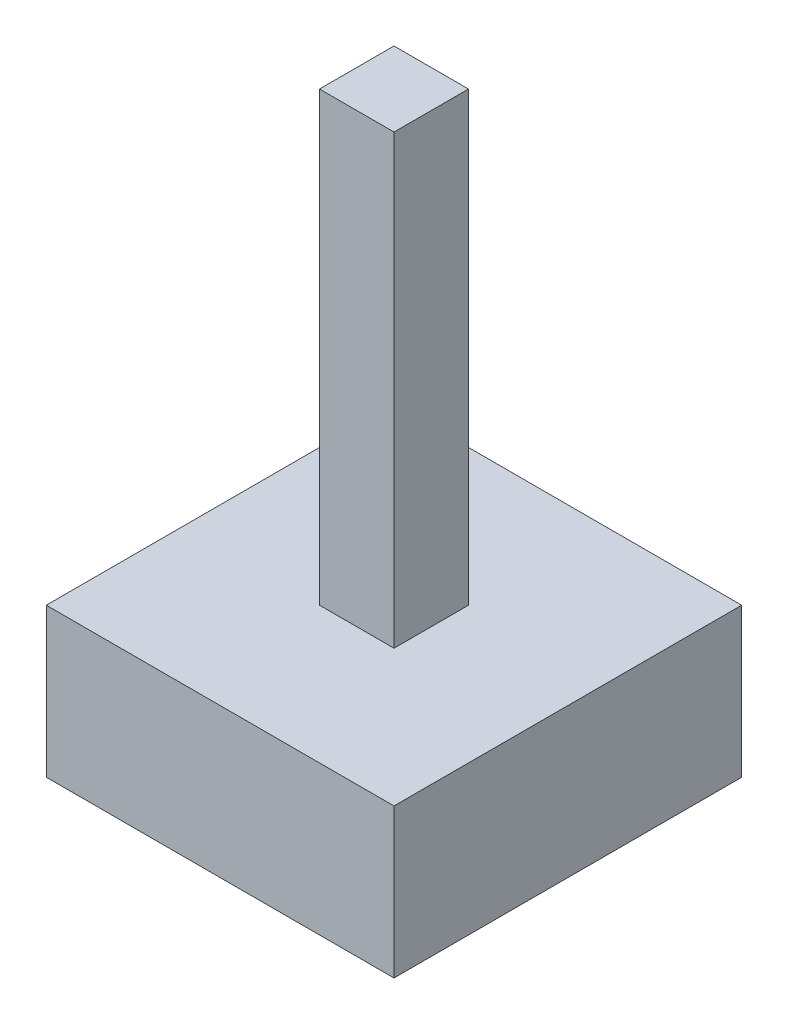
ISO-10303-21;
HEADER;
FILE_DESCRIPTION(('STEP AP214'),'2;1');
FILE_NAME('part.step','',(''),(''),'','','');
FILE_SCHEMA(('AUTOMOTIVE_DESIGN { 1 0 10303 214 1 1 1 1 }'));
ENDSEC;
DATA;
#1=APPLICATION_CONTEXT('core data for automotive mechanical design processes');
#2=APPLICATION_PROTOCOL_DEFINITION('international standard','automotive_design',2000,#1);
#3=PRODUCT_CONTEXT('',#1,'mechanical');
#4=PRODUCT('Part','Part','',(#3));
#5=PRODUCT_RELATED_PRODUCT_CATEGORY('part','',(#4));
#6=PRODUCT_DEFINITION_FORMATION('','',#4);
#7=PRODUCT_DEFINITION_CONTEXT('part definition',#1,'design');
#8=PRODUCT_DEFINITION('design','',#6,#7);
#9=PRODUCT_DEFINITION_SHAPE('','',#8);
#10=(LENGTH_UNIT() NAMED_UNIT(*) SI_UNIT(.MILLI.,.METRE.));
#11=(NAMED_UNIT(*) PLANE_ANGLE_UNIT() SI_UNIT($,.RADIAN.));
#12=(NAMED_UNIT(*) SI_UNIT($,.STERADIAN.) SOLID_ANGLE_UNIT());
#13=UNCERTAINTY_MEASURE_WITH_UNIT(LENGTH_MEASURE(1.E-05),#10,'distance_accuracy_value','');
#14=(GEOMETRIC_REPRESENTATION_CONTEXT(3) GLOBAL_UNCERTAINTY_ASSIGNED_CONTEXT((#13)) GLOBAL_UNIT_ASSIGNED_CONTEXT((#10,
#11,#12)) REPRESENTATION_CONTEXT('',''));
#15=CARTESIAN_POINT('',(0.,0.,0.));
#16=DIRECTION('',(0.,0.,1.));
#17=DIRECTION('',(1.,0.,0.));
#18=AXIS2_PLACEMENT_3D('',#15,#16,#17);
#19=CARTESIAN_POINT('',(0.,3.81,0.));
#20=DIRECTION('',(0.,-1.,0.));
#21=DIRECTION('',(0.,0.,-1.));
#22=AXIS2_PLACEMENT_3D('',#19,#20,#21);
#23=PLANE('',#22);
#24=DIRECTION('',(0.,0.,1.));
#25=VECTOR('',#24,1.);
#26=CARTESIAN_POINT('',(0.,3.81,0.));
#27=LINE('',#26,#25);
#28=CARTESIAN_POINT('',(0.,3.81,-8.89));
#29=VERTEX_POINT('',#28);
#30=CARTESIAN_POINT('',(0.,3.81,0.));
#31=VERTEX_POINT('',#30);
#32=EDGE_CURVE('E132',#29,#31,#27,.T.);
#33=ORIENTED_EDGE('',*,*,#32,.T.);
#34=DIRECTION('',(1.,0.,0.));
#35=VECTOR('',#34,1.);
#36=CARTESIAN_POINT('',(0.,3.81,0.));
#37=LINE('',#36,#35);
#38=CARTESIAN_POINT('',(8.89,3.81,0.));
#39=VERTEX_POINT('',#38);
#40=EDGE_CURVE('E139',#31,#39,#37,.T.);
#41=ORIENTED_EDGE('',*,*,#40,.T.);
#42=DIRECTION('',(0.,0.,-1.));
#43=VECTOR('',#42,1.);
#44=CARTESIAN_POINT('',(8.89,3.81,0.));
#45=LINE('',#44,#43);
#46=CARTESIAN_POINT('',(8.89,3.81,-8.89));
#47=VERTEX_POINT('',#46);
#48=EDGE_CURVE('E143',#39,#47,#45,.T.);
#49=ORIENTED_EDGE('',*,*,#48,.T.);
#50=DIRECTION('',(-1.,0.,0.));
#51=VECTOR('',#50,1.);
#52=CARTESIAN_POINT('',(0.,3.81,-8.89));
#53=LINE('',#52,#51);
#54=EDGE_CURVE('E141',#47,#29,#53,.T.);
#55=ORIENTED_EDGE('',*,*,#54,.T.);
#56=EDGE_LOOP('',(#33,#41,#49,#55));
#57=FACE_BOUND('',#56,.T.);
#58=DIRECTION('',(0.,0.,1.));
#59=VECTOR('',#58,1.);
#60=CARTESIAN_POINT('',(3.4925,3.81,-3.4925));
#61=LINE('',#60,#59);
#62=CARTESIAN_POINT('',(3.4925,3.81,-5.3975));
#63=VERTEX_POINT('',#62);
#64=CARTESIAN_POINT('',(3.4925,3.81,-3.4925));
#65=VERTEX_POINT('',#64);
#66=EDGE_CURVE('E57',#63,#65,#61,.T.);
#67=ORIENTED_EDGE('',*,*,#66,.F.);
#68=DIRECTION('',(-1.,0.,0.));
#69=VECTOR('',#68,1.);
#70=CARTESIAN_POINT('',(3.4925,3.81,-5.3975));
#71=LINE('',#70,#69);
#72=CARTESIAN_POINT('',(5.3975,3.81,-5.3975));
#73=VERTEX_POINT('',#72);
#74=EDGE_CURVE('E58',#73,#63,#71,.T.);
#75=ORIENTED_EDGE('',*,*,#74,.F.);
#76=DIRECTION('',(0.,0.,-1.));
#77=VECTOR('',#76,1.);
#78=CARTESIAN_POINT('',(5.3975,3.81,-3.4925));
#79=LINE('',#78,#77);
#80=CARTESIAN_POINT('',(5.3975,3.81,-3.4925));
#81=VERTEX_POINT('',#80);
#82=EDGE_CURVE('E251',#81,#73,#79,.T.);
#83=ORIENTED_EDGE('',*,*,#82,.F.);
#84=DIRECTION('',(1.,0.,0.));
#85=VECTOR('',#84,1.);
#86=CARTESIAN_POINT('',(3.4925,3.81,-3.4925));
#87=LINE('',#86,#85);
#88=EDGE_CURVE('E259',#65,#81,#87,.T.);
#89=ORIENTED_EDGE('',*,*,#88,.F.);
#90=EDGE_LOOP('',(#67,#75,#83,#89));
#91=FACE_BOUND('',#90,.T.);
#92=ADVANCED_FACE('F41',(#57,#91),#23,.F.);
#93=CARTESIAN_POINT('',(0.,3.81,0.));
#94=DIRECTION('',(1.,0.,0.));
#95=DIRECTION('',(0.,0.,-1.));
#96=AXIS2_PLACEMENT_3D('',#93,#94,#95);
#97=PLANE('',#96);
#98=DIRECTION('',(0.,0.,1.));
#99=VECTOR('',#98,1.);
#100=CARTESIAN_POINT('',(0.,0.,0.));
#101=LINE('',#100,#99);
#102=CARTESIAN_POINT('',(0.,0.,-8.89));
#103=VERTEX_POINT('',#102);
#104=CARTESIAN_POINT('',(0.,0.,0.));
#105=VERTEX_POINT('',#104);
#106=EDGE_CURVE('E127',#103,#105,#101,.T.);
#107=ORIENTED_EDGE('',*,*,#106,.T.);
#108=DIRECTION('',(0.,-1.,0.));
#109=VECTOR('',#108,1.);
#110=CARTESIAN_POINT('',(0.,3.81,0.));
#111=LINE('',#110,#109);
#112=EDGE_CURVE('E11',#31,#105,#111,.T.);
#113=ORIENTED_EDGE('',*,*,#112,.F.);
#114=ORIENTED_EDGE('',*,*,#32,.F.);
#115=DIRECTION('',(0.,-1.,0.));
#116=VECTOR('',#115,1.);
#117=CARTESIAN_POINT('',(0.,3.81,-8.89));
#118=LINE('',#117,#116);
#119=EDGE_CURVE('E145',#29,#103,#118,.T.);
#120=ORIENTED_EDGE('',*,*,#119,.T.);
#121=EDGE_LOOP('',(#107,#113,#114,#120));
#122=FACE_BOUND('',#121,.T.);
#123=ADVANCED_FACE('F43',(#122),#97,.F.);
#124=CARTESIAN_POINT('',(0.,3.81,0.));
#125=DIRECTION('',(0.,0.,-1.));
#126=DIRECTION('',(-1.,0.,0.));
#127=AXIS2_PLACEMENT_3D('',#124,#125,#126);
#128=PLANE('',#127);
#129=DIRECTION('',(1.,0.,0.));
#130=VECTOR('',#129,1.);
#131=CARTESIAN_POINT('',(0.,0.,0.));
#132=LINE('',#131,#130);
#133=CARTESIAN_POINT('',(8.89,0.,0.));
#134=VERTEX_POINT('',#133);
#135=EDGE_CURVE('E129',#105,#134,#132,.T.);
#136=ORIENTED_EDGE('',*,*,#135,.T.);
#137=DIRECTION('',(0.,-1.,0.));
#138=VECTOR('',#137,1.);
#139=CARTESIAN_POINT('',(8.89,3.81,0.));
#140=LINE('',#139,#138);
#141=EDGE_CURVE('E47',#39,#134,#140,.T.);
#142=ORIENTED_EDGE('',*,*,#141,.F.);
#143=ORIENTED_EDGE('',*,*,#40,.F.);
#144=ORIENTED_EDGE('',*,*,#112,.T.);
#145=EDGE_LOOP('',(#136,#142,#143,#144));
#146=FACE_BOUND('',#145,.T.);
#147=ADVANCED_FACE('F173',(#146),#128,.F.);
#148=CARTESIAN_POINT('',(8.89,3.81,0.));
#149=DIRECTION('',(-1.,0.,0.));
#150=DIRECTION('',(0.,0.,1.));
#151=AXIS2_PLACEMENT_3D('',#148,#149,#150);
#152=PLANE('',#151);
#153=DIRECTION('',(0.,0.,-1.));
#154=VECTOR('',#153,1.);
#155=CARTESIAN_POINT('',(8.89,0.,0.));
#156=LINE('',#155,#154);
#157=CARTESIAN_POINT('',(8.89,0.,-8.89));
#158=VERTEX_POINT('',#157);
#159=EDGE_CURVE('E150',#134,#158,#156,.T.);
#160=ORIENTED_EDGE('',*,*,#159,.T.);
#161=DIRECTION('',(0.,-1.,0.));
#162=VECTOR('',#161,1.);
#163=CARTESIAN_POINT('',(8.89,3.81,-8.89));
#164=LINE('',#163,#162);
#165=EDGE_CURVE('E155',#47,#158,#164,.T.);
#166=ORIENTED_EDGE('',*,*,#165,.F.);
#167=ORIENTED_EDGE('',*,*,#48,.F.);
#168=ORIENTED_EDGE('',*,*,#141,.T.);
#169=EDGE_LOOP('',(#160,#166,#167,#168));
#170=FACE_BOUND('',#169,.T.);
#171=ADVANCED_FACE('F157',(#170),#152,.F.);
#172=CARTESIAN_POINT('',(0.,3.81,-8.89));
#173=DIRECTION('',(0.,0.,1.));
#174=DIRECTION('',(1.,0.,0.));
#175=AXIS2_PLACEMENT_3D('',#172,#173,#174);
#176=PLANE('',#175);
#177=DIRECTION('',(-1.,0.,0.));
#178=VECTOR('',#177,1.);
#179=CARTESIAN_POINT('',(0.,0.,-8.89));
#180=LINE('',#179,#178);
#181=EDGE_CURVE('E138',#158,#103,#180,.T.);
#182=ORIENTED_EDGE('',*,*,#181,.T.);
#183=ORIENTED_EDGE('',*,*,#119,.F.);
#184=ORIENTED_EDGE('',*,*,#54,.F.);
#185=ORIENTED_EDGE('',*,*,#165,.T.);
#186=EDGE_LOOP('',(#182,#183,#184,#185));
#187=FACE_BOUND('',#186,.T.);
#188=ADVANCED_FACE('F169',(#187),#176,.F.);
#189=CARTESIAN_POINT('',(0.,0.,0.));
#190=DIRECTION('',(0.,-1.,0.));
#191=DIRECTION('',(0.,0.,-1.));
#192=AXIS2_PLACEMENT_3D('',#189,#190,#191);
#193=PLANE('',#192);
#194=ORIENTED_EDGE('',*,*,#106,.F.);
#195=ORIENTED_EDGE('',*,*,#181,.F.);
#196=ORIENTED_EDGE('',*,*,#159,.F.);
#197=ORIENTED_EDGE('',*,*,#135,.F.);
#198=EDGE_LOOP('',(#194,#195,#196,#197));
#199=FACE_BOUND('',#198,.T.);
#200=ADVANCED_FACE('F164',(#199),#193,.T.);
#201=CARTESIAN_POINT('',(3.4925,15.24,-3.4925));
#202=DIRECTION('',(1.,0.,0.));
#203=DIRECTION('',(0.,0.,-1.));
#204=AXIS2_PLACEMENT_3D('',#201,#202,#203);
#205=PLANE('',#204);
#206=ORIENTED_EDGE('',*,*,#66,.T.);
#207=DIRECTION('',(0.,-1.,0.));
#208=VECTOR('',#207,1.);
#209=CARTESIAN_POINT('',(3.4925,15.24,-3.4925));
#210=LINE('',#209,#208);
#211=CARTESIAN_POINT('',(3.4925,15.24,-3.4925));
#212=VERTEX_POINT('',#211);
#213=EDGE_CURVE('E108',#212,#65,#210,.T.);
#214=ORIENTED_EDGE('',*,*,#213,.F.);
#215=DIRECTION('',(0.,0.,1.));
#216=VECTOR('',#215,1.);
#217=CARTESIAN_POINT('',(3.4925,15.24,-3.4925));
#218=LINE('',#217,#216);
#219=CARTESIAN_POINT('',(3.4925,15.24,-5.3975));
#220=VERTEX_POINT('',#219);
#221=EDGE_CURVE('E113',#220,#212,#218,.T.);
#222=ORIENTED_EDGE('',*,*,#221,.F.);
#223=DIRECTION('',(0.,-1.,0.));
#224=VECTOR('',#223,1.);
#225=CARTESIAN_POINT('',(3.4925,15.24,-5.3975));
#226=LINE('',#225,#224);
#227=EDGE_CURVE('E253',#220,#63,#226,.T.);
#228=ORIENTED_EDGE('',*,*,#227,.T.);
#229=EDGE_LOOP('',(#206,#214,#222,#228));
#230=FACE_BOUND('',#229,.T.);
#231=ADVANCED_FACE('F125',(#230),#205,.F.);
#232=CARTESIAN_POINT('',(3.4925,15.24,-3.4925));
#233=DIRECTION('',(0.,0.,-1.));
#234=DIRECTION('',(-1.,0.,0.));
#235=AXIS2_PLACEMENT_3D('',#232,#233,#234);
#236=PLANE('',#235);
#237=ORIENTED_EDGE('',*,*,#88,.T.);
#238=DIRECTION('',(0.,-1.,0.));
#239=VECTOR('',#238,1.);
#240=CARTESIAN_POINT('',(5.3975,15.24,-3.4925));
#241=LINE('',#240,#239);
#242=CARTESIAN_POINT('',(5.3975,15.24,-3.4925));
#243=VERTEX_POINT('',#242);
#244=EDGE_CURVE('E112',#243,#81,#241,.T.);
#245=ORIENTED_EDGE('',*,*,#244,.F.);
#246=DIRECTION('',(1.,0.,0.));
#247=VECTOR('',#246,1.);
#248=CARTESIAN_POINT('',(3.4925,15.24,-3.4925));
#249=LINE('',#248,#247);
#250=EDGE_CURVE('E102',#212,#243,#249,.T.);
#251=ORIENTED_EDGE('',*,*,#250,.F.);
#252=ORIENTED_EDGE('',*,*,#213,.T.);
#253=EDGE_LOOP('',(#237,#245,#251,#252));
#254=FACE_BOUND('',#253,.T.);
#255=ADVANCED_FACE('F110',(#254),#236,.F.);
#256=CARTESIAN_POINT('',(5.3975,15.24,-3.4925));
#257=DIRECTION('',(-1.,0.,0.));
#258=DIRECTION('',(0.,0.,1.));
#259=AXIS2_PLACEMENT_3D('',#256,#257,#258);
#260=PLANE('',#259);
#261=ORIENTED_EDGE('',*,*,#82,.T.);
#262=DIRECTION('',(0.,-1.,0.));
#263=VECTOR('',#262,1.);
#264=CARTESIAN_POINT('',(5.3975,15.24,-5.3975));
#265=LINE('',#264,#263);
#266=CARTESIAN_POINT('',(5.3975,15.24,-5.3975));
#267=VERTEX_POINT('',#266);
#268=EDGE_CURVE('E134',#267,#73,#265,.T.);
#269=ORIENTED_EDGE('',*,*,#268,.F.);
#270=DIRECTION('',(0.,0.,-1.));
#271=VECTOR('',#270,1.);
#272=CARTESIAN_POINT('',(5.3975,15.24,-3.4925));
#273=LINE('',#272,#271);
#274=EDGE_CURVE('E111',#243,#267,#273,.T.);
#275=ORIENTED_EDGE('',*,*,#274,.F.);
#276=ORIENTED_EDGE('',*,*,#244,.T.);
#277=EDGE_LOOP('',(#261,#269,#275,#276));
#278=FACE_BOUND('',#277,.T.);
#279=ADVANCED_FACE('F222',(#278),#260,.F.);
#280=CARTESIAN_POINT('',(3.4925,15.24,-5.3975));
#281=DIRECTION('',(0.,0.,1.));
#282=DIRECTION('',(1.,0.,0.));
#283=AXIS2_PLACEMENT_3D('',#280,#281,#282);
#284=PLANE('',#283);
#285=ORIENTED_EDGE('',*,*,#74,.T.);
#286=ORIENTED_EDGE('',*,*,#227,.F.);
#287=DIRECTION('',(-1.,0.,0.));
#288=VECTOR('',#287,1.);
#289=CARTESIAN_POINT('',(3.4925,15.24,-5.3975));
#290=LINE('',#289,#288);
#291=EDGE_CURVE('E117',#267,#220,#290,.T.);
#292=ORIENTED_EDGE('',*,*,#291,.F.);
#293=ORIENTED_EDGE('',*,*,#268,.T.);
#294=EDGE_LOOP('',(#285,#286,#292,#293));
#295=FACE_BOUND('',#294,.T.);
#296=ADVANCED_FACE('F228',(#295),#284,.F.);
#297=CARTESIAN_POINT('',(0.,15.24,0.));
#298=DIRECTION('',(0.,-1.,0.));
#299=DIRECTION('',(0.,0.,-1.));
#300=AXIS2_PLACEMENT_3D('',#297,#298,#299);
#301=PLANE('',#300);
#302=ORIENTED_EDGE('',*,*,#221,.T.);
#303=ORIENTED_EDGE('',*,*,#250,.T.);
#304=ORIENTED_EDGE('',*,*,#274,.T.);
#305=ORIENTED_EDGE('',*,*,#291,.T.);
#306=EDGE_LOOP('',(#302,#303,#304,#305));
#307=FACE_BOUND('',#306,.T.);
#308=ADVANCED_FACE('F120',(#307),#301,.F.);
#309=CLOSED_SHELL('',(#92,#123,#147,#171,#188,#200,#231,#255,#279,#296,#308));
#310=MANIFOLD_SOLID_BREP('B2',#309);
#311=ADVANCED_BREP_SHAPE_REPRESENTATION('',(#18,#310),#14);
#312=SHAPE_DEFINITION_REPRESENTATION(#9,#311);
ENDSEC;
END-ISO-10303-21;
